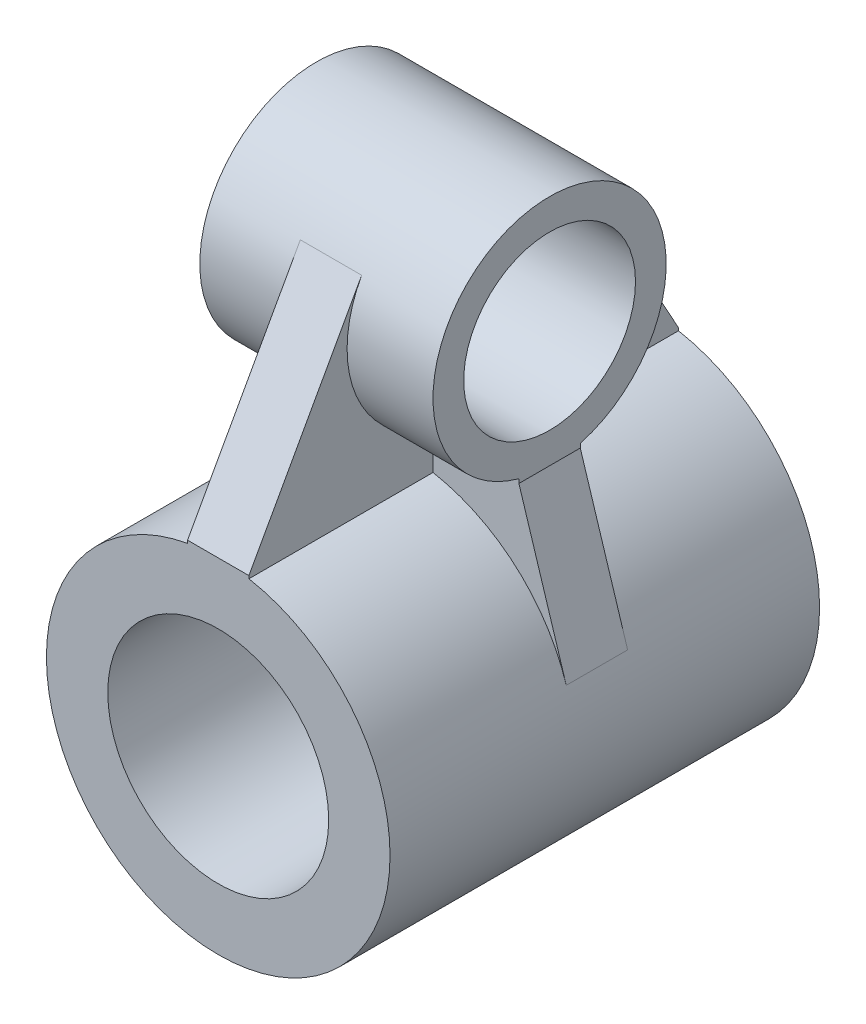
ISO-10303-21;
HEADER;
FILE_DESCRIPTION(('STEP AP214'),'2;1');
FILE_NAME('part.step','',(''),(''),'','','');
FILE_SCHEMA(('AUTOMOTIVE_DESIGN { 1 0 10303 214 1 1 1 1 }'));
ENDSEC;
DATA;
#1=APPLICATION_CONTEXT('core data for automotive mechanical design processes');
#2=APPLICATION_PROTOCOL_DEFINITION('international standard','automotive_design',2000,#1);
#3=PRODUCT_CONTEXT('',#1,'mechanical');
#4=PRODUCT('Part','Part','',(#3));
#5=PRODUCT_RELATED_PRODUCT_CATEGORY('part','',(#4));
#6=PRODUCT_DEFINITION_FORMATION('','',#4);
#7=PRODUCT_DEFINITION_CONTEXT('part definition',#1,'design');
#8=PRODUCT_DEFINITION('design','',#6,#7);
#9=PRODUCT_DEFINITION_SHAPE('','',#8);
#10=(LENGTH_UNIT() NAMED_UNIT(*) SI_UNIT(.MILLI.,.METRE.));
#11=(NAMED_UNIT(*) PLANE_ANGLE_UNIT() SI_UNIT($,.RADIAN.));
#12=(NAMED_UNIT(*) SI_UNIT($,.STERADIAN.) SOLID_ANGLE_UNIT());
#13=UNCERTAINTY_MEASURE_WITH_UNIT(LENGTH_MEASURE(1.E-05),#10,'distance_accuracy_value','');
#14=(GEOMETRIC_REPRESENTATION_CONTEXT(3) GLOBAL_UNCERTAINTY_ASSIGNED_CONTEXT((#13)) GLOBAL_UNIT_ASSIGNED_CONTEXT((#10,
#11,#12)) REPRESENTATION_CONTEXT('',''));
#15=CARTESIAN_POINT('',(0.,0.,0.));
#16=DIRECTION('',(0.,0.,1.));
#17=DIRECTION('',(1.,0.,0.));
#18=AXIS2_PLACEMENT_3D('',#15,#16,#17);
#19=CARTESIAN_POINT('',(2.5,26.,0.));
#20=DIRECTION('',(1.,0.,0.));
#21=DIRECTION('',(0.,0.,-1.));
#22=AXIS2_PLACEMENT_3D('',#19,#20,#21);
#23=PLANE('',#22);
#24=CARTESIAN_POINT('',(2.5,26.,0.));
#25=DIRECTION('',(-1.,0.,0.));
#26=DIRECTION('',(0.,0.,-1.));
#27=AXIS2_PLACEMENT_3D('',#24,#25,#26);
#28=CIRCLE('',#27,9.5);
#29=CARTESIAN_POINT('',(2.5,30.6004929839377,-8.31176661755729));
#30=VERTEX_POINT('',#29);
#31=CARTESIAN_POINT('',(2.5,16.8348486100883,-2.5));
#32=VERTEX_POINT('',#31);
#33=EDGE_CURVE('E223',#30,#32,#28,.T.);
#34=ORIENTED_EDGE('',*,*,#33,.T.);
#35=DIRECTION('',(0.,-1.,0.));
#36=VECTOR('',#35,1.);
#37=CARTESIAN_POINT('',(2.5,26.,-2.5));
#38=LINE('',#37,#36);
#39=CARTESIAN_POINT('',(2.5,13.7749773139559,-2.5));
#40=VERTEX_POINT('',#39);
#41=EDGE_CURVE('E43',#32,#40,#38,.T.);
#42=ORIENTED_EDGE('',*,*,#41,.T.);
#43=DIRECTION('',(0.,0.,-1.));
#44=VECTOR('',#43,1.);
#45=CARTESIAN_POINT('',(2.5,13.7749773139559,17.5));
#46=LINE('',#45,#44);
#47=CARTESIAN_POINT('',(2.5,13.7749773139559,-17.5));
#48=VERTEX_POINT('',#47);
#49=EDGE_CURVE('E217',#48,#40,#46,.F.);
#50=ORIENTED_EDGE('',*,*,#49,.F.);
#51=DIRECTION('',(0.,1.,0.));
#52=VECTOR('',#51,1.);
#53=CARTESIAN_POINT('',(2.5,0.,-17.5));
#54=LINE('',#53,#52);
#55=CARTESIAN_POINT('',(2.5,14.,-17.5));
#56=VERTEX_POINT('',#55);
#57=EDGE_CURVE('E201',#48,#56,#54,.T.);
#58=ORIENTED_EDGE('',*,*,#57,.T.);
#59=DIRECTION('',(0.,-0.874922801848136,-0.484262419361865));
#60=VECTOR('',#59,1.);
#61=CARTESIAN_POINT('',(2.5,10.6977553448991,-19.3277646697811));
#62=LINE('',#61,#60);
#63=EDGE_CURVE('E203',#30,#56,#62,.T.);
#64=ORIENTED_EDGE('',*,*,#63,.F.);
#65=EDGE_LOOP('',(#34,#42,#50,#58,#64));
#66=FACE_BOUND('',#65,.T.);
#67=ADVANCED_FACE('F35',(#66),#23,.T.);
#68=CARTESIAN_POINT('',(-2.5,-14.002,17.5));
#69=DIRECTION('',(1.,0.,0.));
#70=DIRECTION('',(0.,0.,-1.));
#71=AXIS2_PLACEMENT_3D('',#68,#69,#70);
#72=PLANE('',#71);
#73=DIRECTION('',(0.,-1.,0.));
#74=VECTOR('',#73,1.);
#75=CARTESIAN_POINT('',(-2.5,-14.002,-2.5));
#76=LINE('',#75,#74);
#77=CARTESIAN_POINT('',(-2.5,16.8348486100883,-2.5));
#78=VERTEX_POINT('',#77);
#79=CARTESIAN_POINT('',(-2.5,13.7749773139559,-2.5));
#80=VERTEX_POINT('',#79);
#81=EDGE_CURVE('E195',#78,#80,#76,.T.);
#82=ORIENTED_EDGE('',*,*,#81,.F.);
#83=CARTESIAN_POINT('',(-2.5,26.,0.));
#84=DIRECTION('',(-1.,0.,0.));
#85=DIRECTION('',(0.,0.,-1.));
#86=AXIS2_PLACEMENT_3D('',#83,#84,#85);
#87=CIRCLE('',#86,9.5);
#88=CARTESIAN_POINT('',(-2.5,30.6004929839377,-8.31176661755729));
#89=VERTEX_POINT('',#88);
#90=EDGE_CURVE('E231',#89,#78,#87,.T.);
#91=ORIENTED_EDGE('',*,*,#90,.F.);
#92=DIRECTION('',(0.,-0.874922801848136,-0.484262419361865));
#93=VECTOR('',#92,1.);
#94=CARTESIAN_POINT('',(-2.5,10.6977553448991,-19.3277646697811));
#95=LINE('',#94,#93);
#96=CARTESIAN_POINT('',(-2.5,14.,-17.5));
#97=VERTEX_POINT('',#96);
#98=EDGE_CURVE('E204',#89,#97,#95,.T.);
#99=ORIENTED_EDGE('',*,*,#98,.T.);
#100=DIRECTION('',(0.,1.,0.));
#101=VECTOR('',#100,1.);
#102=CARTESIAN_POINT('',(-2.5,0.,-17.5));
#103=LINE('',#102,#101);
#104=CARTESIAN_POINT('',(-2.5,13.7749773139559,-17.5));
#105=VERTEX_POINT('',#104);
#106=EDGE_CURVE('E200',#105,#97,#103,.T.);
#107=ORIENTED_EDGE('',*,*,#106,.F.);
#108=DIRECTION('',(0.,0.,-1.));
#109=VECTOR('',#108,1.);
#110=CARTESIAN_POINT('',(-2.5,13.7749773139559,17.5));
#111=LINE('',#110,#109);
#112=EDGE_CURVE('E247',#80,#105,#111,.T.);
#113=ORIENTED_EDGE('',*,*,#112,.F.);
#114=EDGE_LOOP('',(#82,#91,#99,#107,#113));
#115=FACE_BOUND('',#114,.T.);
#116=ADVANCED_FACE('F333',(#115),#72,.F.);
#117=CARTESIAN_POINT('',(0.,0.,17.5));
#118=DIRECTION('',(0.,0.,-1.));
#119=DIRECTION('',(-1.,0.,0.));
#120=AXIS2_PLACEMENT_3D('',#117,#118,#119);
#121=CYLINDRICAL_SURFACE('',#120,14.);
#122=DIRECTION('',(0.,0.,-1.));
#123=VECTOR('',#122,1.);
#124=CARTESIAN_POINT('',(13.3591881518076,4.18713409441378,2.5));
#125=LINE('',#124,#123);
#126=CARTESIAN_POINT('',(13.3591881518076,4.18713409441378,2.5));
#127=VERTEX_POINT('',#126);
#128=CARTESIAN_POINT('',(13.3591881518076,4.18713409441378,-2.5));
#129=VERTEX_POINT('',#128);
#130=EDGE_CURVE('E162',#127,#129,#125,.T.);
#131=ORIENTED_EDGE('',*,*,#130,.F.);
#132=CARTESIAN_POINT('',(0.,0.,2.5));
#133=DIRECTION('',(0.,0.,-1.));
#134=DIRECTION('',(-1.,0.,0.));
#135=AXIS2_PLACEMENT_3D('',#132,#133,#134);
#136=CIRCLE('',#135,14.);
#137=CARTESIAN_POINT('',(2.5,13.7749773139559,2.5));
#138=VERTEX_POINT('',#137);
#139=EDGE_CURVE('E148',#138,#127,#136,.T.);
#140=ORIENTED_EDGE('',*,*,#139,.F.);
#141=CARTESIAN_POINT('',(2.5,13.7749773139559,17.5));
#142=VERTEX_POINT('',#141);
#143=EDGE_CURVE('E220',#138,#142,#46,.F.);
#144=ORIENTED_EDGE('',*,*,#143,.T.);
#145=CARTESIAN_POINT('',(0.,0.,17.5));
#146=DIRECTION('',(0.,0.,1.));
#147=DIRECTION('',(1.,0.,0.));
#148=AXIS2_PLACEMENT_3D('',#145,#146,#147);
#149=CIRCLE('',#148,14.);
#150=CARTESIAN_POINT('',(-2.5,13.7749773139559,17.5));
#151=VERTEX_POINT('',#150);
#152=EDGE_CURVE('E264',#151,#142,#149,.T.);
#153=ORIENTED_EDGE('',*,*,#152,.F.);
#154=CARTESIAN_POINT('',(-2.5,13.7749773139559,2.5));
#155=VERTEX_POINT('',#154);
#156=EDGE_CURVE('E253',#151,#155,#111,.T.);
#157=ORIENTED_EDGE('',*,*,#156,.T.);
#158=CARTESIAN_POINT('',(0.,0.,2.5));
#159=DIRECTION('',(0.,0.,1.));
#160=DIRECTION('',(1.,0.,0.));
#161=AXIS2_PLACEMENT_3D('',#158,#159,#160);
#162=CIRCLE('',#161,14.);
#163=CARTESIAN_POINT('',(-13.3591881518076,4.18713409441378,2.5));
#164=VERTEX_POINT('',#163);
#165=EDGE_CURVE('E58',#155,#164,#162,.T.);
#166=ORIENTED_EDGE('',*,*,#165,.T.);
#167=DIRECTION('',(0.,0.,-1.));
#168=VECTOR('',#167,1.);
#169=CARTESIAN_POINT('',(-13.3591881518076,4.18713409441378,2.5));
#170=LINE('',#169,#168);
#171=CARTESIAN_POINT('',(-13.3591881518076,4.18713409441378,-2.5));
#172=VERTEX_POINT('',#171);
#173=EDGE_CURVE('E184',#164,#172,#170,.T.);
#174=ORIENTED_EDGE('',*,*,#173,.T.);
#175=CARTESIAN_POINT('',(0.,0.,-2.5));
#176=DIRECTION('',(0.,0.,1.));
#177=DIRECTION('',(1.,0.,0.));
#178=AXIS2_PLACEMENT_3D('',#175,#176,#177);
#179=CIRCLE('',#178,14.);
#180=EDGE_CURVE('E176',#80,#172,#179,.T.);
#181=ORIENTED_EDGE('',*,*,#180,.F.);
#182=ORIENTED_EDGE('',*,*,#112,.T.);
#183=CARTESIAN_POINT('',(0.,0.,-17.5));
#184=DIRECTION('',(0.,0.,1.));
#185=DIRECTION('',(1.,0.,0.));
#186=AXIS2_PLACEMENT_3D('',#183,#184,#185);
#187=CIRCLE('',#186,14.);
#188=EDGE_CURVE('E261',#105,#48,#187,.T.);
#189=ORIENTED_EDGE('',*,*,#188,.T.);
#190=ORIENTED_EDGE('',*,*,#49,.T.);
#191=CARTESIAN_POINT('',(0.,0.,-2.5));
#192=DIRECTION('',(0.,0.,-1.));
#193=DIRECTION('',(-1.,0.,0.));
#194=AXIS2_PLACEMENT_3D('',#191,#192,#193);
#195=CIRCLE('',#194,14.);
#196=EDGE_CURVE('E50',#40,#129,#195,.T.);
#197=ORIENTED_EDGE('',*,*,#196,.T.);
#198=EDGE_LOOP('',(#131,#140,#144,#153,#157,#166,#174,#181,#182,#189,#190,#197));
#199=FACE_BOUND('',#198,.T.);
#200=ADVANCED_FACE('F37',(#199),#121,.T.);
#201=CARTESIAN_POINT('',(0.,0.,17.5));
#202=DIRECTION('',(0.,0.,1.));
#203=DIRECTION('',(1.,0.,0.));
#204=AXIS2_PLACEMENT_3D('',#201,#202,#203);
#205=PLANE('',#204);
#206=ORIENTED_EDGE('',*,*,#152,.T.);
#207=DIRECTION('',(0.,1.,0.));
#208=VECTOR('',#207,1.);
#209=CARTESIAN_POINT('',(2.5,-14.002,17.5));
#210=LINE('',#209,#208);
#211=CARTESIAN_POINT('',(2.5,14.,17.5));
#212=VERTEX_POINT('',#211);
#213=EDGE_CURVE('E216',#142,#212,#210,.T.);
#214=ORIENTED_EDGE('',*,*,#213,.T.);
#215=DIRECTION('',(-1.,0.,0.));
#216=VECTOR('',#215,1.);
#217=CARTESIAN_POINT('',(2.5,14.,17.5));
#218=LINE('',#217,#216);
#219=CARTESIAN_POINT('',(-2.5,14.,17.5));
#220=VERTEX_POINT('',#219);
#221=EDGE_CURVE('E252',#212,#220,#218,.T.);
#222=ORIENTED_EDGE('',*,*,#221,.T.);
#223=DIRECTION('',(0.,1.,0.));
#224=VECTOR('',#223,1.);
#225=CARTESIAN_POINT('',(-2.5,-14.002,17.5));
#226=LINE('',#225,#224);
#227=EDGE_CURVE('E249',#151,#220,#226,.T.);
#228=ORIENTED_EDGE('',*,*,#227,.F.);
#229=EDGE_LOOP('',(#206,#214,#222,#228));
#230=FACE_BOUND('',#229,.T.);
#231=CARTESIAN_POINT('',(0.,0.,17.5));
#232=DIRECTION('',(0.,0.,1.));
#233=DIRECTION('',(1.,0.,0.));
#234=AXIS2_PLACEMENT_3D('',#231,#232,#233);
#235=CIRCLE('',#234,9.);
#236=CARTESIAN_POINT('',(9.,0.,17.5));
#237=VERTEX_POINT('',#236);
#238=EDGE_CURVE('E258',#237,#237,#235,.T.);
#239=ORIENTED_EDGE('',*,*,#238,.F.);
#240=EDGE_LOOP('',(#239));
#241=FACE_BOUND('',#240,.T.);
#242=ADVANCED_FACE('F316',(#230,#241),#205,.T.);
#243=CARTESIAN_POINT('',(0.,0.,-17.5));
#244=DIRECTION('',(0.,0.,1.));
#245=DIRECTION('',(1.,0.,0.));
#246=AXIS2_PLACEMENT_3D('',#243,#244,#245);
#247=PLANE('',#246);
#248=ORIENTED_EDGE('',*,*,#106,.T.);
#249=DIRECTION('',(-1.,0.,0.));
#250=VECTOR('',#249,1.);
#251=CARTESIAN_POINT('',(2.5,14.,-17.5));
#252=LINE('',#251,#250);
#253=EDGE_CURVE('E214',#56,#97,#252,.T.);
#254=ORIENTED_EDGE('',*,*,#253,.F.);
#255=ORIENTED_EDGE('',*,*,#57,.F.);
#256=ORIENTED_EDGE('',*,*,#188,.F.);
#257=EDGE_LOOP('',(#248,#254,#255,#256));
#258=FACE_BOUND('',#257,.T.);
#259=CARTESIAN_POINT('',(0.,0.,-17.5));
#260=DIRECTION('',(0.,0.,1.));
#261=DIRECTION('',(1.,0.,0.));
#262=AXIS2_PLACEMENT_3D('',#259,#260,#261);
#263=CIRCLE('',#262,9.);
#264=CARTESIAN_POINT('',(9.,0.,-17.5));
#265=VERTEX_POINT('',#264);
#266=EDGE_CURVE('E256',#265,#265,#263,.T.);
#267=ORIENTED_EDGE('',*,*,#266,.T.);
#268=EDGE_LOOP('',(#267));
#269=FACE_BOUND('',#268,.T.);
#270=ADVANCED_FACE('F281',(#258,#269),#247,.F.);
#271=CARTESIAN_POINT('',(0.,0.,17.5));
#272=DIRECTION('',(0.,0.,-1.));
#273=DIRECTION('',(-1.,0.,0.));
#274=AXIS2_PLACEMENT_3D('',#271,#272,#273);
#275=CYLINDRICAL_SURFACE('',#274,9.);
#276=ORIENTED_EDGE('',*,*,#238,.T.);
#277=EDGE_LOOP('',(#276));
#278=FACE_BOUND('',#277,.T.);
#279=ORIENTED_EDGE('',*,*,#266,.F.);
#280=EDGE_LOOP('',(#279));
#281=FACE_BOUND('',#280,.T.);
#282=ADVANCED_FACE('F345',(#278,#281),#275,.F.);
#283=CARTESIAN_POINT('',(-2.5,16.8348486100883,2.5));
#284=VERTEX_POINT('',#283);
#285=CARTESIAN_POINT('',(-2.5,30.6004929839377,8.31176661755729));
#286=VERTEX_POINT('',#285);
#287=EDGE_CURVE('E219',#284,#286,#87,.T.);
#288=ORIENTED_EDGE('',*,*,#287,.F.);
#289=DIRECTION('',(0.,-1.,0.));
#290=VECTOR('',#289,1.);
#291=CARTESIAN_POINT('',(-2.5,-14.002,2.5));
#292=LINE('',#291,#290);
#293=EDGE_CURVE('E198',#284,#155,#292,.T.);
#294=ORIENTED_EDGE('',*,*,#293,.T.);
#295=ORIENTED_EDGE('',*,*,#156,.F.);
#296=ORIENTED_EDGE('',*,*,#227,.T.);
#297=DIRECTION('',(0.,-0.874922801848136,0.484262419361865));
#298=VECTOR('',#297,1.);
#299=CARTESIAN_POINT('',(-2.5,30.6004929839377,8.31176661755729));
#300=LINE('',#299,#298);
#301=EDGE_CURVE('E233',#286,#220,#300,.T.);
#302=ORIENTED_EDGE('',*,*,#301,.F.);
#303=EDGE_LOOP('',(#288,#294,#295,#296,#302));
#304=FACE_BOUND('',#303,.T.);
#305=ADVANCED_FACE('F313',(#304),#72,.F.);
#306=CARTESIAN_POINT('',(9.5,26.,0.));
#307=DIRECTION('',(1.,0.,0.));
#308=DIRECTION('',(0.,0.,-1.));
#309=AXIS2_PLACEMENT_3D('',#306,#307,#308);
#310=PLANE('',#309);
#311=CARTESIAN_POINT('',(9.5,26.,0.));
#312=DIRECTION('',(1.,0.,0.));
#313=DIRECTION('',(0.,0.,-1.));
#314=AXIS2_PLACEMENT_3D('',#311,#312,#313);
#315=CIRCLE('',#314,9.5);
#316=CARTESIAN_POINT('',(9.5,16.8348486100883,-2.5));
#317=VERTEX_POINT('',#316);
#318=CARTESIAN_POINT('',(9.5,16.8348486100883,2.5));
#319=VERTEX_POINT('',#318);
#320=EDGE_CURVE('E244',#317,#319,#315,.T.);
#321=ORIENTED_EDGE('',*,*,#320,.T.);
#322=DIRECTION('',(0.,-1.,0.));
#323=VECTOR('',#322,1.);
#324=CARTESIAN_POINT('',(9.5,0.,2.5));
#325=LINE('',#324,#323);
#326=CARTESIAN_POINT('',(9.5,16.5,2.5));
#327=VERTEX_POINT('',#326);
#328=EDGE_CURVE('E164',#319,#327,#325,.T.);
#329=ORIENTED_EDGE('',*,*,#328,.T.);
#330=DIRECTION('',(0.,0.,-1.));
#331=VECTOR('',#330,1.);
#332=CARTESIAN_POINT('',(9.5,16.5,2.5));
#333=LINE('',#332,#331);
#334=CARTESIAN_POINT('',(9.5,16.5,-2.5));
#335=VERTEX_POINT('',#334);
#336=EDGE_CURVE('E163',#327,#335,#333,.T.);
#337=ORIENTED_EDGE('',*,*,#336,.T.);
#338=DIRECTION('',(0.,-1.,0.));
#339=VECTOR('',#338,1.);
#340=CARTESIAN_POINT('',(9.5,0.,-2.5));
#341=LINE('',#340,#339);
#342=EDGE_CURVE('E156',#317,#335,#341,.T.);
#343=ORIENTED_EDGE('',*,*,#342,.F.);
#344=EDGE_LOOP('',(#321,#329,#337,#343));
#345=FACE_BOUND('',#344,.T.);
#346=CARTESIAN_POINT('',(9.5,26.,0.));
#347=DIRECTION('',(1.,0.,0.));
#348=DIRECTION('',(0.,0.,-1.));
#349=AXIS2_PLACEMENT_3D('',#346,#347,#348);
#350=CIRCLE('',#349,7.);
#351=CARTESIAN_POINT('',(9.5,26.,-7.));
#352=VERTEX_POINT('',#351);
#353=EDGE_CURVE('E238',#352,#352,#350,.T.);
#354=ORIENTED_EDGE('',*,*,#353,.F.);
#355=EDGE_LOOP('',(#354));
#356=FACE_BOUND('',#355,.T.);
#357=ADVANCED_FACE('F297',(#345,#356),#310,.T.);
#358=CARTESIAN_POINT('',(-9.5,26.,0.));
#359=DIRECTION('',(1.,0.,0.));
#360=DIRECTION('',(0.,0.,-1.));
#361=AXIS2_PLACEMENT_3D('',#358,#359,#360);
#362=PLANE('',#361);
#363=DIRECTION('',(0.,-1.,0.));
#364=VECTOR('',#363,1.);
#365=CARTESIAN_POINT('',(-9.5,0.,2.5));
#366=LINE('',#365,#364);
#367=CARTESIAN_POINT('',(-9.5,16.8348486100883,2.5));
#368=VERTEX_POINT('',#367);
#369=CARTESIAN_POINT('',(-9.5,16.5,2.5));
#370=VERTEX_POINT('',#369);
#371=EDGE_CURVE('E178',#368,#370,#366,.T.);
#372=ORIENTED_EDGE('',*,*,#371,.F.);
#373=CARTESIAN_POINT('',(-9.5,26.,0.));
#374=DIRECTION('',(1.,0.,0.));
#375=DIRECTION('',(0.,0.,-1.));
#376=AXIS2_PLACEMENT_3D('',#373,#374,#375);
#377=CIRCLE('',#376,9.5);
#378=CARTESIAN_POINT('',(-9.5,16.8348486100883,-2.5));
#379=VERTEX_POINT('',#378);
#380=EDGE_CURVE('E241',#379,#368,#377,.T.);
#381=ORIENTED_EDGE('',*,*,#380,.F.);
#382=DIRECTION('',(0.,-1.,0.));
#383=VECTOR('',#382,1.);
#384=CARTESIAN_POINT('',(-9.5,0.,-2.5));
#385=LINE('',#384,#383);
#386=CARTESIAN_POINT('',(-9.5,16.5,-2.5));
#387=VERTEX_POINT('',#386);
#388=EDGE_CURVE('E187',#379,#387,#385,.T.);
#389=ORIENTED_EDGE('',*,*,#388,.T.);
#390=DIRECTION('',(0.,0.,-1.));
#391=VECTOR('',#390,1.);
#392=CARTESIAN_POINT('',(-9.5,16.5,2.5));
#393=LINE('',#392,#391);
#394=EDGE_CURVE('E193',#370,#387,#393,.T.);
#395=ORIENTED_EDGE('',*,*,#394,.F.);
#396=EDGE_LOOP('',(#372,#381,#389,#395));
#397=FACE_BOUND('',#396,.T.);
#398=CARTESIAN_POINT('',(-9.5,26.,0.));
#399=DIRECTION('',(1.,0.,0.));
#400=DIRECTION('',(0.,0.,-1.));
#401=AXIS2_PLACEMENT_3D('',#398,#399,#400);
#402=CIRCLE('',#401,7.);
#403=CARTESIAN_POINT('',(-9.5,26.,-7.));
#404=VERTEX_POINT('',#403);
#405=EDGE_CURVE('E237',#404,#404,#402,.T.);
#406=ORIENTED_EDGE('',*,*,#405,.T.);
#407=EDGE_LOOP('',(#406));
#408=FACE_BOUND('',#407,.T.);
#409=ADVANCED_FACE('F350',(#397,#408),#362,.F.);
#410=CARTESIAN_POINT('',(9.5,26.,0.));
#411=DIRECTION('',(-1.,0.,0.));
#412=DIRECTION('',(0.,0.,1.));
#413=AXIS2_PLACEMENT_3D('',#410,#411,#412);
#414=CYLINDRICAL_SURFACE('',#413,9.5);
#415=CARTESIAN_POINT('',(2.5,16.8348486100883,2.5));
#416=VERTEX_POINT('',#415);
#417=CARTESIAN_POINT('',(2.5,30.6004929839377,8.31176661755729));
#418=VERTEX_POINT('',#417);
#419=EDGE_CURVE('E227',#416,#418,#28,.T.);
#420=ORIENTED_EDGE('',*,*,#419,.F.);
#421=DIRECTION('',(-1.,0.,0.));
#422=VECTOR('',#421,1.);
#423=CARTESIAN_POINT('',(9.5,16.8348486100883,2.5));
#424=LINE('',#423,#422);
#425=EDGE_CURVE('E169',#416,#319,#424,.F.);
#426=ORIENTED_EDGE('',*,*,#425,.T.);
#427=ORIENTED_EDGE('',*,*,#320,.F.);
#428=DIRECTION('',(-1.,0.,0.));
#429=VECTOR('',#428,1.);
#430=CARTESIAN_POINT('',(9.5,16.8348486100883,-2.5));
#431=LINE('',#430,#429);
#432=EDGE_CURVE('E167',#32,#317,#431,.F.);
#433=ORIENTED_EDGE('',*,*,#432,.F.);
#434=ORIENTED_EDGE('',*,*,#33,.F.);
#435=DIRECTION('',(-1.,0.,0.));
#436=VECTOR('',#435,1.);
#437=CARTESIAN_POINT('',(2.5,30.6004929839377,-8.31176661755729));
#438=LINE('',#437,#436);
#439=EDGE_CURVE('E207',#30,#89,#438,.T.);
#440=ORIENTED_EDGE('',*,*,#439,.T.);
#441=ORIENTED_EDGE('',*,*,#90,.T.);
#442=DIRECTION('',(-1.,0.,0.));
#443=VECTOR('',#442,1.);
#444=CARTESIAN_POINT('',(9.5,16.8348486100883,-2.5));
#445=LINE('',#444,#443);
#446=EDGE_CURVE('E267',#379,#78,#445,.F.);
#447=ORIENTED_EDGE('',*,*,#446,.F.);
#448=ORIENTED_EDGE('',*,*,#380,.T.);
#449=DIRECTION('',(-1.,0.,0.));
#450=VECTOR('',#449,1.);
#451=CARTESIAN_POINT('',(9.5,16.8348486100883,2.5));
#452=LINE('',#451,#450);
#453=EDGE_CURVE('E272',#368,#284,#452,.F.);
#454=ORIENTED_EDGE('',*,*,#453,.T.);
#455=ORIENTED_EDGE('',*,*,#287,.T.);
#456=DIRECTION('',(-1.,0.,0.));
#457=VECTOR('',#456,1.);
#458=CARTESIAN_POINT('',(2.5,30.6004929839377,8.31176661755729));
#459=LINE('',#458,#457);
#460=EDGE_CURVE('E230',#418,#286,#459,.T.);
#461=ORIENTED_EDGE('',*,*,#460,.F.);
#462=EDGE_LOOP('',(#420,#426,#427,#433,#434,#440,#441,#447,#448,#454,#455,#461));
#463=FACE_BOUND('',#462,.T.);
#464=ADVANCED_FACE('F290',(#463),#414,.T.);
#465=CARTESIAN_POINT('',(9.5,26.,0.));
#466=DIRECTION('',(-1.,0.,0.));
#467=DIRECTION('',(0.,0.,1.));
#468=AXIS2_PLACEMENT_3D('',#465,#466,#467);
#469=CYLINDRICAL_SURFACE('',#468,7.);
#470=ORIENTED_EDGE('',*,*,#353,.T.);
#471=EDGE_LOOP('',(#470));
#472=FACE_BOUND('',#471,.T.);
#473=ORIENTED_EDGE('',*,*,#405,.F.);
#474=EDGE_LOOP('',(#473));
#475=FACE_BOUND('',#474,.T.);
#476=ADVANCED_FACE('F384',(#472,#475),#469,.F.);
#477=CARTESIAN_POINT('',(2.5,30.6004929839377,8.31176661755729));
#478=DIRECTION('',(0.,-0.484262419361865,-0.874922801848136));
#479=DIRECTION('',(0.,0.874922801848136,-0.484262419361865));
#480=AXIS2_PLACEMENT_3D('',#477,#478,#479);
#481=PLANE('',#480);
#482=ORIENTED_EDGE('',*,*,#301,.T.);
#483=ORIENTED_EDGE('',*,*,#221,.F.);
#484=DIRECTION('',(0.,-0.874922801848136,0.484262419361865));
#485=VECTOR('',#484,1.);
#486=CARTESIAN_POINT('',(2.5,30.6004929839377,8.31176661755729));
#487=LINE('',#486,#485);
#488=EDGE_CURVE('E226',#418,#212,#487,.T.);
#489=ORIENTED_EDGE('',*,*,#488,.F.);
#490=ORIENTED_EDGE('',*,*,#460,.T.);
#491=EDGE_LOOP('',(#482,#483,#489,#490));
#492=FACE_BOUND('',#491,.T.);
#493=ADVANCED_FACE('F319',(#492),#481,.F.);
#494=DIRECTION('',(0.,-1.,0.));
#495=VECTOR('',#494,1.);
#496=CARTESIAN_POINT('',(2.5,26.,2.5));
#497=LINE('',#496,#495);
#498=EDGE_CURVE('E11',#416,#138,#497,.T.);
#499=ORIENTED_EDGE('',*,*,#498,.F.);
#500=ORIENTED_EDGE('',*,*,#419,.T.);
#501=ORIENTED_EDGE('',*,*,#488,.T.);
#502=ORIENTED_EDGE('',*,*,#213,.F.);
#503=ORIENTED_EDGE('',*,*,#143,.F.);
#504=EDGE_LOOP('',(#499,#500,#501,#502,#503));
#505=FACE_BOUND('',#504,.T.);
#506=ADVANCED_FACE('F306',(#505),#23,.T.);
#507=CARTESIAN_POINT('',(2.5,10.6977553448991,-19.3277646697811));
#508=DIRECTION('',(0.,0.484262419361865,-0.874922801848136));
#509=DIRECTION('',(0.,0.874922801848136,0.484262419361865));
#510=AXIS2_PLACEMENT_3D('',#507,#508,#509);
#511=PLANE('',#510);
#512=ORIENTED_EDGE('',*,*,#98,.F.);
#513=ORIENTED_EDGE('',*,*,#439,.F.);
#514=ORIENTED_EDGE('',*,*,#63,.T.);
#515=ORIENTED_EDGE('',*,*,#253,.T.);
#516=EDGE_LOOP('',(#512,#513,#514,#515));
#517=FACE_BOUND('',#516,.T.);
#518=ADVANCED_FACE('F287',(#517),#511,.T.);
#519=CARTESIAN_POINT('',(0.,0.,2.5));
#520=DIRECTION('',(0.,0.,1.));
#521=DIRECTION('',(1.,0.,0.));
#522=AXIS2_PLACEMENT_3D('',#519,#520,#521);
#523=PLANE('',#522);
#524=ORIENTED_EDGE('',*,*,#293,.F.);
#525=ORIENTED_EDGE('',*,*,#453,.F.);
#526=ORIENTED_EDGE('',*,*,#371,.T.);
#527=DIRECTION('',(0.299081006743842,0.954227725129117,0.));
#528=VECTOR('',#527,1.);
#529=CARTESIAN_POINT('',(-13.3591881518076,4.18713409441378,2.5));
#530=LINE('',#529,#528);
#531=EDGE_CURVE('E181',#164,#370,#530,.T.);
#532=ORIENTED_EDGE('',*,*,#531,.F.);
#533=ORIENTED_EDGE('',*,*,#165,.F.);
#534=EDGE_LOOP('',(#524,#525,#526,#532,#533));
#535=FACE_BOUND('',#534,.T.);
#536=ADVANCED_FACE('F322',(#535),#523,.T.);
#537=CARTESIAN_POINT('',(0.,0.,-2.5));
#538=DIRECTION('',(0.,0.,1.));
#539=DIRECTION('',(1.,0.,0.));
#540=AXIS2_PLACEMENT_3D('',#537,#538,#539);
#541=PLANE('',#540);
#542=ORIENTED_EDGE('',*,*,#446,.T.);
#543=ORIENTED_EDGE('',*,*,#81,.T.);
#544=ORIENTED_EDGE('',*,*,#180,.T.);
#545=DIRECTION('',(0.299081006743842,0.954227725129117,0.));
#546=VECTOR('',#545,1.);
#547=CARTESIAN_POINT('',(-13.3591881518076,4.18713409441378,-2.5));
#548=LINE('',#547,#546);
#549=EDGE_CURVE('E179',#172,#387,#548,.T.);
#550=ORIENTED_EDGE('',*,*,#549,.T.);
#551=ORIENTED_EDGE('',*,*,#388,.F.);
#552=EDGE_LOOP('',(#542,#543,#544,#550,#551));
#553=FACE_BOUND('',#552,.T.);
#554=ADVANCED_FACE('F330',(#553),#541,.F.);
#555=CARTESIAN_POINT('',(-13.3591881518076,4.18713409441378,2.5));
#556=DIRECTION('',(-0.954227725129117,0.299081006743842,0.));
#557=DIRECTION('',(-0.299081006743842,-0.954227725129117,0.));
#558=AXIS2_PLACEMENT_3D('',#555,#556,#557);
#559=PLANE('',#558);
#560=ORIENTED_EDGE('',*,*,#549,.F.);
#561=ORIENTED_EDGE('',*,*,#173,.F.);
#562=ORIENTED_EDGE('',*,*,#531,.T.);
#563=ORIENTED_EDGE('',*,*,#394,.T.);
#564=EDGE_LOOP('',(#560,#561,#562,#563));
#565=FACE_BOUND('',#564,.T.);
#566=ADVANCED_FACE('F328',(#565),#559,.T.);
#567=CARTESIAN_POINT('',(0.,0.,2.5));
#568=DIRECTION('',(0.,0.,1.));
#569=DIRECTION('',(-1.,0.,0.));
#570=AXIS2_PLACEMENT_3D('',#567,#568,#569);
#571=PLANE('',#570);
#572=ORIENTED_EDGE('',*,*,#425,.F.);
#573=ORIENTED_EDGE('',*,*,#498,.T.);
#574=ORIENTED_EDGE('',*,*,#139,.T.);
#575=DIRECTION('',(-0.299081006743842,0.954227725129117,0.));
#576=VECTOR('',#575,1.);
#577=CARTESIAN_POINT('',(13.3591881518076,4.18713409441378,2.5));
#578=LINE('',#577,#576);
#579=EDGE_CURVE('E151',#127,#327,#578,.T.);
#580=ORIENTED_EDGE('',*,*,#579,.T.);
#581=ORIENTED_EDGE('',*,*,#328,.F.);
#582=EDGE_LOOP('',(#572,#573,#574,#580,#581));
#583=FACE_BOUND('',#582,.T.);
#584=ADVANCED_FACE('F150',(#583),#571,.T.);
#585=CARTESIAN_POINT('',(0.,0.,-2.5));
#586=DIRECTION('',(0.,0.,1.));
#587=DIRECTION('',(-1.,0.,0.));
#588=AXIS2_PLACEMENT_3D('',#585,#586,#587);
#589=PLANE('',#588);
#590=ORIENTED_EDGE('',*,*,#41,.F.);
#591=ORIENTED_EDGE('',*,*,#432,.T.);
#592=ORIENTED_EDGE('',*,*,#342,.T.);
#593=DIRECTION('',(-0.299081006743842,0.954227725129117,0.));
#594=VECTOR('',#593,1.);
#595=CARTESIAN_POINT('',(13.3591881518076,4.18713409441378,-2.5));
#596=LINE('',#595,#594);
#597=EDGE_CURVE('E299',#129,#335,#596,.T.);
#598=ORIENTED_EDGE('',*,*,#597,.F.);
#599=ORIENTED_EDGE('',*,*,#196,.F.);
#600=EDGE_LOOP('',(#590,#591,#592,#598,#599));
#601=FACE_BOUND('',#600,.T.);
#602=ADVANCED_FACE('F295',(#601),#589,.F.);
#603=CARTESIAN_POINT('',(13.3591881518076,4.18713409441378,2.5));
#604=DIRECTION('',(-0.954227725129117,-0.299081006743842,0.));
#605=DIRECTION('',(0.299081006743842,-0.954227725129117,0.));
#606=AXIS2_PLACEMENT_3D('',#603,#604,#605);
#607=PLANE('',#606);
#608=ORIENTED_EDGE('',*,*,#597,.T.);
#609=ORIENTED_EDGE('',*,*,#336,.F.);
#610=ORIENTED_EDGE('',*,*,#579,.F.);
#611=ORIENTED_EDGE('',*,*,#130,.T.);
#612=EDGE_LOOP('',(#608,#609,#610,#611));
#613=FACE_BOUND('',#612,.T.);
#614=ADVANCED_FACE('F161',(#613),#607,.F.);
#615=CLOSED_SHELL('',(#67,#116,#200,#242,#270,#282,#305,#357,#409,#464,#476,#493,#506,#518,#536,
#554,#566,#584,#602,#614));
#616=MANIFOLD_SOLID_BREP('B2',#615);
#617=ADVANCED_BREP_SHAPE_REPRESENTATION('',(#18,#616),#14);
#618=SHAPE_DEFINITION_REPRESENTATION(#9,#617);
ENDSEC;
END-ISO-10303-21;
